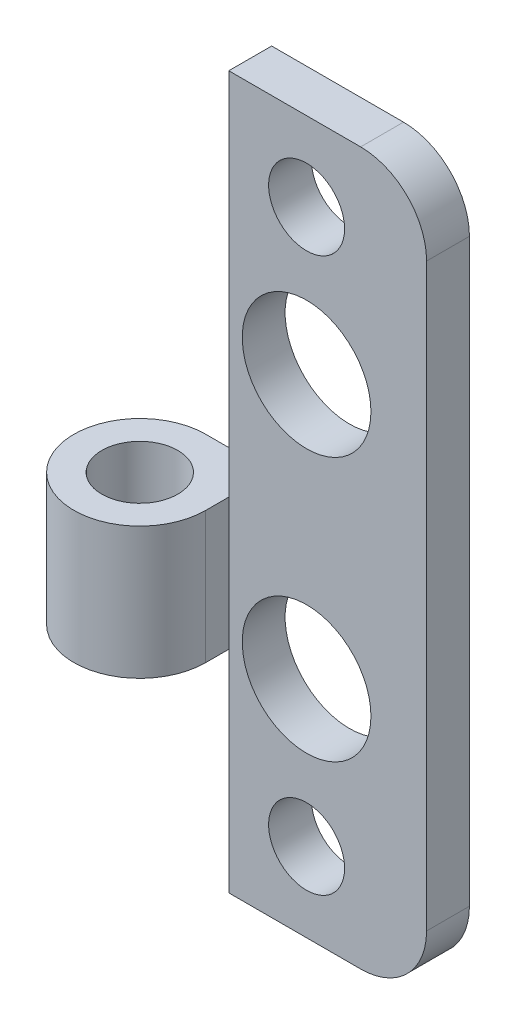
ISO-10303-21;
HEADER;
FILE_DESCRIPTION(('STEP AP214'),'2;1');
FILE_NAME('part.step','',(''),(''),'','','');
FILE_SCHEMA(('AUTOMOTIVE_DESIGN { 1 0 10303 214 1 1 1 1 }'));
ENDSEC;
DATA;
#1=APPLICATION_CONTEXT('core data for automotive mechanical design processes');
#2=APPLICATION_PROTOCOL_DEFINITION('international standard','automotive_design',2000,#1);
#3=PRODUCT_CONTEXT('',#1,'mechanical');
#4=PRODUCT('Part','Part','',(#3));
#5=PRODUCT_RELATED_PRODUCT_CATEGORY('part','',(#4));
#6=PRODUCT_DEFINITION_FORMATION('','',#4);
#7=PRODUCT_DEFINITION_CONTEXT('part definition',#1,'design');
#8=PRODUCT_DEFINITION('design','',#6,#7);
#9=PRODUCT_DEFINITION_SHAPE('','',#8);
#10=(LENGTH_UNIT() NAMED_UNIT(*) SI_UNIT(.MILLI.,.METRE.));
#11=(NAMED_UNIT(*) PLANE_ANGLE_UNIT() SI_UNIT($,.RADIAN.));
#12=(NAMED_UNIT(*) SI_UNIT($,.STERADIAN.) SOLID_ANGLE_UNIT());
#13=UNCERTAINTY_MEASURE_WITH_UNIT(LENGTH_MEASURE(1.E-05),#10,'distance_accuracy_value','');
#14=(GEOMETRIC_REPRESENTATION_CONTEXT(3) GLOBAL_UNCERTAINTY_ASSIGNED_CONTEXT((#13)) GLOBAL_UNIT_ASSIGNED_CONTEXT((#10,
#11,#12)) REPRESENTATION_CONTEXT('',''));
#15=CARTESIAN_POINT('',(0.,0.,0.));
#16=DIRECTION('',(0.,0.,1.));
#17=DIRECTION('',(1.,0.,0.));
#18=AXIS2_PLACEMENT_3D('',#15,#16,#17);
#19=CARTESIAN_POINT('',(0.,0.,4.1275));
#20=DIRECTION('',(1.,0.,0.));
#21=DIRECTION('',(0.,1.,0.));
#22=AXIS2_PLACEMENT_3D('',#19,#20,#21);
#23=PLANE('',#22);
#24=DIRECTION('',(0.,0.,1.));
#25=VECTOR('',#24,1.);
#26=CARTESIAN_POINT('',(0.,20.32,4.1275));
#27=LINE('',#26,#25);
#28=CARTESIAN_POINT('',(0.,20.32,0.));
#29=VERTEX_POINT('',#28);
#30=CARTESIAN_POINT('',(0.,20.32,4.1275));
#31=VERTEX_POINT('',#30);
#32=EDGE_CURVE('E11',#29,#31,#27,.T.);
#33=ORIENTED_EDGE('',*,*,#32,.F.);
#34=DIRECTION('',(0.,-1.,0.));
#35=VECTOR('',#34,1.);
#36=CARTESIAN_POINT('',(0.,0.,0.));
#37=LINE('',#36,#35);
#38=CARTESIAN_POINT('',(0.,0.,0.));
#39=VERTEX_POINT('',#38);
#40=EDGE_CURVE('E134',#29,#39,#37,.T.);
#41=ORIENTED_EDGE('',*,*,#40,.T.);
#42=DIRECTION('',(0.,0.,-1.));
#43=VECTOR('',#42,1.);
#44=CARTESIAN_POINT('',(0.,0.,4.1275));
#45=LINE('',#44,#43);
#46=CARTESIAN_POINT('',(0.,0.,4.1275));
#47=VERTEX_POINT('',#46);
#48=EDGE_CURVE('E148',#47,#39,#45,.T.);
#49=ORIENTED_EDGE('',*,*,#48,.F.);
#50=DIRECTION('',(0.,-1.,0.));
#51=VECTOR('',#50,1.);
#52=CARTESIAN_POINT('',(0.,0.,4.1275));
#53=LINE('',#52,#51);
#54=EDGE_CURVE('E91',#31,#47,#53,.T.);
#55=ORIENTED_EDGE('',*,*,#54,.F.);
#56=EDGE_LOOP('',(#33,#41,#49,#55));
#57=FACE_BOUND('',#56,.T.);
#58=ADVANCED_FACE('F32',(#57),#23,.F.);
#59=CARTESIAN_POINT('',(12.7,62.23,4.1275));
#60=DIRECTION('',(0.,0.,1.));
#61=DIRECTION('',(1.,0.,0.));
#62=AXIS2_PLACEMENT_3D('',#59,#60,#61);
#63=PLANE('',#62);
#64=CARTESIAN_POINT('',(7.49300000000002,21.59,4.1275));
#65=DIRECTION('',(0.,0.,1.));
#66=DIRECTION('',(1.,0.,0.));
#67=AXIS2_PLACEMENT_3D('',#64,#65,#66);
#68=CIRCLE('',#67,6.1976);
#69=CARTESIAN_POINT('',(13.6906,21.59,4.1275));
#70=VERTEX_POINT('',#69);
#71=EDGE_CURVE('E208',#70,#70,#68,.T.);
#72=ORIENTED_EDGE('',*,*,#71,.F.);
#73=EDGE_LOOP('',(#72));
#74=FACE_BOUND('',#73,.T.);
#75=CARTESIAN_POINT('',(7.49300000000006,46.99,4.1275));
#76=DIRECTION('',(0.,0.,1.));
#77=DIRECTION('',(1.,0.,0.));
#78=AXIS2_PLACEMENT_3D('',#75,#76,#77);
#79=CIRCLE('',#78,6.1976);
#80=CARTESIAN_POINT('',(13.6906000000001,46.99,4.1275));
#81=VERTEX_POINT('',#80);
#82=EDGE_CURVE('E202',#81,#81,#79,.T.);
#83=ORIENTED_EDGE('',*,*,#82,.F.);
#84=EDGE_LOOP('',(#83));
#85=FACE_BOUND('',#84,.T.);
#86=CARTESIAN_POINT('',(7.493,60.96,4.1275));
#87=DIRECTION('',(0.,0.,1.));
#88=DIRECTION('',(1.,0.,0.));
#89=AXIS2_PLACEMENT_3D('',#86,#87,#88);
#90=CIRCLE('',#89,3.6576);
#91=CARTESIAN_POINT('',(11.1506,60.96,4.1275));
#92=VERTEX_POINT('',#91);
#93=EDGE_CURVE('E166',#92,#92,#90,.T.);
#94=ORIENTED_EDGE('',*,*,#93,.F.);
#95=EDGE_LOOP('',(#94));
#96=FACE_BOUND('',#95,.T.);
#97=CARTESIAN_POINT('',(0.,68.58,4.1275));
#98=VERTEX_POINT('',#97);
#99=CARTESIAN_POINT('',(0.,33.02,4.1275));
#100=VERTEX_POINT('',#99);
#101=EDGE_CURVE('E153',#98,#100,#53,.T.);
#102=ORIENTED_EDGE('',*,*,#101,.T.);
#103=EDGE_CURVE('E158',#100,#31,#53,.T.);
#104=ORIENTED_EDGE('',*,*,#103,.T.);
#105=ORIENTED_EDGE('',*,*,#54,.T.);
#106=DIRECTION('',(1.,0.,0.));
#107=VECTOR('',#106,1.);
#108=CARTESIAN_POINT('',(0.,0.,4.1275));
#109=LINE('',#108,#107);
#110=CARTESIAN_POINT('',(12.7,0.,4.1275));
#111=VERTEX_POINT('',#110);
#112=EDGE_CURVE('E159',#47,#111,#109,.T.);
#113=ORIENTED_EDGE('',*,*,#112,.T.);
#114=CARTESIAN_POINT('',(12.7,6.35,4.1275));
#115=DIRECTION('',(0.,0.,1.));
#116=DIRECTION('',(1.,0.,0.));
#117=AXIS2_PLACEMENT_3D('',#114,#115,#116);
#118=CIRCLE('',#117,6.35);
#119=CARTESIAN_POINT('',(19.05,6.35000000000005,4.1275));
#120=VERTEX_POINT('',#119);
#121=EDGE_CURVE('E109',#111,#120,#118,.T.);
#122=ORIENTED_EDGE('',*,*,#121,.T.);
#123=DIRECTION('',(0.,1.,0.));
#124=VECTOR('',#123,1.);
#125=CARTESIAN_POINT('',(19.05,6.35000000000004,4.1275));
#126=LINE('',#125,#124);
#127=CARTESIAN_POINT('',(19.05,62.23,4.1275));
#128=VERTEX_POINT('',#127);
#129=EDGE_CURVE('E101',#120,#128,#126,.T.);
#130=ORIENTED_EDGE('',*,*,#129,.T.);
#131=CARTESIAN_POINT('',(12.7,62.23,4.1275));
#132=DIRECTION('',(0.,0.,1.));
#133=DIRECTION('',(1.,0.,0.));
#134=AXIS2_PLACEMENT_3D('',#131,#132,#133);
#135=CIRCLE('',#134,6.35);
#136=CARTESIAN_POINT('',(12.7,68.58,4.1275));
#137=VERTEX_POINT('',#136);
#138=EDGE_CURVE('E106',#128,#137,#135,.T.);
#139=ORIENTED_EDGE('',*,*,#138,.T.);
#140=DIRECTION('',(-1.,0.,0.));
#141=VECTOR('',#140,1.);
#142=CARTESIAN_POINT('',(0.,68.58,4.1275));
#143=LINE('',#142,#141);
#144=EDGE_CURVE('E56',#137,#98,#143,.T.);
#145=ORIENTED_EDGE('',*,*,#144,.T.);
#146=EDGE_LOOP('',(#102,#104,#105,#113,#122,#130,#139,#145));
#147=FACE_BOUND('',#146,.T.);
#148=CARTESIAN_POINT('',(7.49300000000001,7.62,4.1275));
#149=DIRECTION('',(0.,0.,1.));
#150=DIRECTION('',(1.,0.,0.));
#151=AXIS2_PLACEMENT_3D('',#148,#149,#150);
#152=CIRCLE('',#151,3.6576);
#153=CARTESIAN_POINT('',(11.1506,7.62,4.1275));
#154=VERTEX_POINT('',#153);
#155=EDGE_CURVE('E167',#154,#154,#152,.T.);
#156=ORIENTED_EDGE('',*,*,#155,.F.);
#157=EDGE_LOOP('',(#156));
#158=FACE_BOUND('',#157,.T.);
#159=ADVANCED_FACE('F103',(#74,#85,#96,#147,#158),#63,.T.);
#160=CARTESIAN_POINT('',(12.7,62.23,0.));
#161=DIRECTION('',(0.,0.,1.));
#162=DIRECTION('',(1.,0.,0.));
#163=AXIS2_PLACEMENT_3D('',#160,#161,#162);
#164=PLANE('',#163);
#165=CARTESIAN_POINT('',(7.49300000000002,21.59,0.));
#166=DIRECTION('',(0.,0.,1.));
#167=DIRECTION('',(1.,0.,0.));
#168=AXIS2_PLACEMENT_3D('',#165,#166,#167);
#169=CIRCLE('',#168,6.1976);
#170=CARTESIAN_POINT('',(13.6906,21.59,0.));
#171=VERTEX_POINT('',#170);
#172=EDGE_CURVE('E205',#171,#171,#169,.T.);
#173=ORIENTED_EDGE('',*,*,#172,.T.);
#174=EDGE_LOOP('',(#173));
#175=FACE_BOUND('',#174,.T.);
#176=CARTESIAN_POINT('',(7.49300000000006,46.99,0.));
#177=DIRECTION('',(0.,0.,1.));
#178=DIRECTION('',(1.,0.,0.));
#179=AXIS2_PLACEMENT_3D('',#176,#177,#178);
#180=CIRCLE('',#179,6.1976);
#181=CARTESIAN_POINT('',(13.6906000000001,46.99,0.));
#182=VERTEX_POINT('',#181);
#183=EDGE_CURVE('E199',#182,#182,#180,.T.);
#184=ORIENTED_EDGE('',*,*,#183,.T.);
#185=EDGE_LOOP('',(#184));
#186=FACE_BOUND('',#185,.T.);
#187=CARTESIAN_POINT('',(0.,68.58,0.));
#188=VERTEX_POINT('',#187);
#189=CARTESIAN_POINT('',(0.,33.02,0.));
#190=VERTEX_POINT('',#189);
#191=EDGE_CURVE('E130',#188,#190,#37,.T.);
#192=ORIENTED_EDGE('',*,*,#191,.F.);
#193=DIRECTION('',(-1.,0.,0.));
#194=VECTOR('',#193,1.);
#195=CARTESIAN_POINT('',(0.,68.58,0.));
#196=LINE('',#195,#194);
#197=CARTESIAN_POINT('',(12.7,68.58,0.));
#198=VERTEX_POINT('',#197);
#199=EDGE_CURVE('E83',#198,#188,#196,.T.);
#200=ORIENTED_EDGE('',*,*,#199,.F.);
#201=CARTESIAN_POINT('',(12.7,62.23,0.));
#202=DIRECTION('',(0.,0.,1.));
#203=DIRECTION('',(1.,0.,0.));
#204=AXIS2_PLACEMENT_3D('',#201,#202,#203);
#205=CIRCLE('',#204,6.35);
#206=CARTESIAN_POINT('',(19.05,62.23,0.));
#207=VERTEX_POINT('',#206);
#208=EDGE_CURVE('E139',#207,#198,#205,.T.);
#209=ORIENTED_EDGE('',*,*,#208,.F.);
#210=DIRECTION('',(0.,1.,0.));
#211=VECTOR('',#210,1.);
#212=CARTESIAN_POINT('',(19.05,6.35000000000004,0.));
#213=LINE('',#212,#211);
#214=CARTESIAN_POINT('',(19.05,6.35000000000005,0.));
#215=VERTEX_POINT('',#214);
#216=EDGE_CURVE('E118',#215,#207,#213,.T.);
#217=ORIENTED_EDGE('',*,*,#216,.F.);
#218=CARTESIAN_POINT('',(12.7,6.35,0.));
#219=DIRECTION('',(0.,0.,1.));
#220=DIRECTION('',(1.,0.,0.));
#221=AXIS2_PLACEMENT_3D('',#218,#219,#220);
#222=CIRCLE('',#221,6.35);
#223=CARTESIAN_POINT('',(12.7,0.,0.));
#224=VERTEX_POINT('',#223);
#225=EDGE_CURVE('E136',#224,#215,#222,.T.);
#226=ORIENTED_EDGE('',*,*,#225,.F.);
#227=DIRECTION('',(1.,0.,0.));
#228=VECTOR('',#227,1.);
#229=CARTESIAN_POINT('',(0.,0.,0.));
#230=LINE('',#229,#228);
#231=EDGE_CURVE('E133',#39,#224,#230,.T.);
#232=ORIENTED_EDGE('',*,*,#231,.F.);
#233=ORIENTED_EDGE('',*,*,#40,.F.);
#234=DIRECTION('',(-1.,0.,0.));
#235=VECTOR('',#234,1.);
#236=CARTESIAN_POINT('',(0.,20.32,0.));
#237=LINE('',#236,#235);
#238=CARTESIAN_POINT('',(-6.35,20.32,0.));
#239=VERTEX_POINT('',#238);
#240=EDGE_CURVE('E191',#29,#239,#237,.T.);
#241=ORIENTED_EDGE('',*,*,#240,.T.);
#242=DIRECTION('',(0.,1.,0.));
#243=VECTOR('',#242,1.);
#244=CARTESIAN_POINT('',(-6.35,20.32,0.));
#245=LINE('',#244,#243);
#246=CARTESIAN_POINT('',(-6.35,33.02,0.));
#247=VERTEX_POINT('',#246);
#248=EDGE_CURVE('E176',#239,#247,#245,.T.);
#249=ORIENTED_EDGE('',*,*,#248,.T.);
#250=DIRECTION('',(-1.,0.,0.));
#251=VECTOR('',#250,1.);
#252=CARTESIAN_POINT('',(0.,33.02,0.));
#253=LINE('',#252,#251);
#254=EDGE_CURVE('E186',#190,#247,#253,.T.);
#255=ORIENTED_EDGE('',*,*,#254,.F.);
#256=EDGE_LOOP('',(#192,#200,#209,#217,#226,#232,#233,#241,#249,#255));
#257=FACE_BOUND('',#256,.T.);
#258=CARTESIAN_POINT('',(7.493,60.96,0.));
#259=DIRECTION('',(0.,0.,1.));
#260=DIRECTION('',(1.,0.,0.));
#261=AXIS2_PLACEMENT_3D('',#258,#259,#260);
#262=CIRCLE('',#261,3.6576);
#263=CARTESIAN_POINT('',(11.1506,60.96,0.));
#264=VERTEX_POINT('',#263);
#265=EDGE_CURVE('E163',#264,#264,#262,.T.);
#266=ORIENTED_EDGE('',*,*,#265,.T.);
#267=EDGE_LOOP('',(#266));
#268=FACE_BOUND('',#267,.T.);
#269=CARTESIAN_POINT('',(7.49300000000001,7.62,0.));
#270=DIRECTION('',(0.,0.,1.));
#271=DIRECTION('',(1.,0.,0.));
#272=AXIS2_PLACEMENT_3D('',#269,#270,#271);
#273=CIRCLE('',#272,3.6576);
#274=CARTESIAN_POINT('',(11.1506,7.62,0.));
#275=VERTEX_POINT('',#274);
#276=EDGE_CURVE('E170',#275,#275,#273,.T.);
#277=ORIENTED_EDGE('',*,*,#276,.T.);
#278=EDGE_LOOP('',(#277));
#279=FACE_BOUND('',#278,.T.);
#280=ADVANCED_FACE('F214',(#175,#186,#257,#268,#279),#164,.F.);
#281=ORIENTED_EDGE('',*,*,#191,.T.);
#282=DIRECTION('',(0.,0.,1.));
#283=VECTOR('',#282,1.);
#284=CARTESIAN_POINT('',(0.,33.02,4.1275));
#285=LINE('',#284,#283);
#286=EDGE_CURVE('E40',#190,#100,#285,.T.);
#287=ORIENTED_EDGE('',*,*,#286,.T.);
#288=ORIENTED_EDGE('',*,*,#101,.F.);
#289=DIRECTION('',(0.,0.,-1.));
#290=VECTOR('',#289,1.);
#291=CARTESIAN_POINT('',(0.,68.58,4.1275));
#292=LINE('',#291,#290);
#293=EDGE_CURVE('E126',#98,#188,#292,.T.);
#294=ORIENTED_EDGE('',*,*,#293,.T.);
#295=EDGE_LOOP('',(#281,#287,#288,#294));
#296=FACE_BOUND('',#295,.T.);
#297=ADVANCED_FACE('F34',(#296),#23,.F.);
#298=CARTESIAN_POINT('',(0.,0.,4.1275));
#299=DIRECTION('',(0.,1.,0.));
#300=DIRECTION('',(0.,0.,1.));
#301=AXIS2_PLACEMENT_3D('',#298,#299,#300);
#302=PLANE('',#301);
#303=ORIENTED_EDGE('',*,*,#231,.T.);
#304=DIRECTION('',(0.,0.,-1.));
#305=VECTOR('',#304,1.);
#306=CARTESIAN_POINT('',(12.7,0.,4.1275));
#307=LINE('',#306,#305);
#308=EDGE_CURVE('E145',#111,#224,#307,.T.);
#309=ORIENTED_EDGE('',*,*,#308,.F.);
#310=ORIENTED_EDGE('',*,*,#112,.F.);
#311=ORIENTED_EDGE('',*,*,#48,.T.);
#312=EDGE_LOOP('',(#303,#309,#310,#311));
#313=FACE_BOUND('',#312,.T.);
#314=ADVANCED_FACE('F261',(#313),#302,.F.);
#315=CARTESIAN_POINT('',(12.7,6.35,4.1275));
#316=DIRECTION('',(0.,0.,-1.));
#317=DIRECTION('',(-1.,0.,0.));
#318=AXIS2_PLACEMENT_3D('',#315,#316,#317);
#319=CYLINDRICAL_SURFACE('',#318,6.35);
#320=ORIENTED_EDGE('',*,*,#225,.T.);
#321=DIRECTION('',(0.,0.,-1.));
#322=VECTOR('',#321,1.);
#323=CARTESIAN_POINT('',(19.05,6.35000000000005,4.1275));
#324=LINE('',#323,#322);
#325=EDGE_CURVE('E121',#120,#215,#324,.T.);
#326=ORIENTED_EDGE('',*,*,#325,.F.);
#327=ORIENTED_EDGE('',*,*,#121,.F.);
#328=ORIENTED_EDGE('',*,*,#308,.T.);
#329=EDGE_LOOP('',(#320,#326,#327,#328));
#330=FACE_BOUND('',#329,.T.);
#331=ADVANCED_FACE('F265',(#330),#319,.T.);
#332=CARTESIAN_POINT('',(19.05,6.35000000000004,4.1275));
#333=DIRECTION('',(-1.,0.,0.));
#334=DIRECTION('',(0.,-1.,0.));
#335=AXIS2_PLACEMENT_3D('',#332,#333,#334);
#336=PLANE('',#335);
#337=ORIENTED_EDGE('',*,*,#216,.T.);
#338=DIRECTION('',(0.,0.,-1.));
#339=VECTOR('',#338,1.);
#340=CARTESIAN_POINT('',(19.05,62.23,4.1275));
#341=LINE('',#340,#339);
#342=EDGE_CURVE('E115',#128,#207,#341,.T.);
#343=ORIENTED_EDGE('',*,*,#342,.F.);
#344=ORIENTED_EDGE('',*,*,#129,.F.);
#345=ORIENTED_EDGE('',*,*,#325,.T.);
#346=EDGE_LOOP('',(#337,#343,#344,#345));
#347=FACE_BOUND('',#346,.T.);
#348=ADVANCED_FACE('F116',(#347),#336,.F.);
#349=CARTESIAN_POINT('',(12.7,62.23,4.1275));
#350=DIRECTION('',(0.,0.,-1.));
#351=DIRECTION('',(-1.,0.,0.));
#352=AXIS2_PLACEMENT_3D('',#349,#350,#351);
#353=CYLINDRICAL_SURFACE('',#352,6.35);
#354=ORIENTED_EDGE('',*,*,#208,.T.);
#355=DIRECTION('',(0.,0.,-1.));
#356=VECTOR('',#355,1.);
#357=CARTESIAN_POINT('',(12.7,68.58,4.1275));
#358=LINE('',#357,#356);
#359=EDGE_CURVE('E122',#137,#198,#358,.T.);
#360=ORIENTED_EDGE('',*,*,#359,.F.);
#361=ORIENTED_EDGE('',*,*,#138,.F.);
#362=ORIENTED_EDGE('',*,*,#342,.T.);
#363=EDGE_LOOP('',(#354,#360,#361,#362));
#364=FACE_BOUND('',#363,.T.);
#365=ADVANCED_FACE('F124',(#364),#353,.T.);
#366=CARTESIAN_POINT('',(0.,68.58,4.1275));
#367=DIRECTION('',(0.,-1.,0.));
#368=DIRECTION('',(0.,0.,-1.));
#369=AXIS2_PLACEMENT_3D('',#366,#367,#368);
#370=PLANE('',#369);
#371=ORIENTED_EDGE('',*,*,#199,.T.);
#372=ORIENTED_EDGE('',*,*,#293,.F.);
#373=ORIENTED_EDGE('',*,*,#144,.F.);
#374=ORIENTED_EDGE('',*,*,#359,.T.);
#375=EDGE_LOOP('',(#371,#372,#373,#374));
#376=FACE_BOUND('',#375,.T.);
#377=ADVANCED_FACE('F235',(#376),#370,.F.);
#378=CARTESIAN_POINT('',(7.493,60.96,4.1275));
#379=DIRECTION('',(0.,0.,-1.));
#380=DIRECTION('',(-1.,0.,0.));
#381=AXIS2_PLACEMENT_3D('',#378,#379,#380);
#382=CYLINDRICAL_SURFACE('',#381,3.6576);
#383=ORIENTED_EDGE('',*,*,#93,.T.);
#384=EDGE_LOOP('',(#383));
#385=FACE_BOUND('',#384,.T.);
#386=ORIENTED_EDGE('',*,*,#265,.F.);
#387=EDGE_LOOP('',(#386));
#388=FACE_BOUND('',#387,.T.);
#389=ADVANCED_FACE('F231',(#385,#388),#382,.F.);
#390=CARTESIAN_POINT('',(7.49300000000001,7.62,4.1275));
#391=DIRECTION('',(0.,0.,-1.));
#392=DIRECTION('',(-1.,0.,0.));
#393=AXIS2_PLACEMENT_3D('',#390,#391,#392);
#394=CYLINDRICAL_SURFACE('',#393,3.6576);
#395=ORIENTED_EDGE('',*,*,#155,.T.);
#396=EDGE_LOOP('',(#395));
#397=FACE_BOUND('',#396,.T.);
#398=ORIENTED_EDGE('',*,*,#276,.F.);
#399=EDGE_LOOP('',(#398));
#400=FACE_BOUND('',#399,.T.);
#401=ADVANCED_FACE('F234',(#397,#400),#394,.F.);
#402=CARTESIAN_POINT('',(0.,20.32,6.35));
#403=DIRECTION('',(1.,0.,0.));
#404=DIRECTION('',(0.,0.,-1.));
#405=AXIS2_PLACEMENT_3D('',#402,#403,#404);
#406=PLANE('',#405);
#407=DIRECTION('',(0.,0.,-1.));
#408=VECTOR('',#407,1.);
#409=CARTESIAN_POINT('',(0.,20.32,4.1275));
#410=LINE('',#409,#408);
#411=CARTESIAN_POINT('',(0.,20.32,6.35));
#412=VERTEX_POINT('',#411);
#413=EDGE_CURVE('E183',#412,#31,#410,.T.);
#414=ORIENTED_EDGE('',*,*,#413,.T.);
#415=ORIENTED_EDGE('',*,*,#103,.F.);
#416=DIRECTION('',(0.,0.,-1.));
#417=VECTOR('',#416,1.);
#418=CARTESIAN_POINT('',(0.,33.02,6.35));
#419=LINE('',#418,#417);
#420=CARTESIAN_POINT('',(0.,33.02,6.35));
#421=VERTEX_POINT('',#420);
#422=EDGE_CURVE('E47',#421,#100,#419,.T.);
#423=ORIENTED_EDGE('',*,*,#422,.F.);
#424=DIRECTION('',(0.,1.,0.));
#425=VECTOR('',#424,1.);
#426=CARTESIAN_POINT('',(0.,20.32,6.35));
#427=LINE('',#426,#425);
#428=EDGE_CURVE('E173',#412,#421,#427,.T.);
#429=ORIENTED_EDGE('',*,*,#428,.F.);
#430=EDGE_LOOP('',(#414,#415,#423,#429));
#431=FACE_BOUND('',#430,.T.);
#432=ADVANCED_FACE('F245',(#431),#406,.T.);
#433=CARTESIAN_POINT('',(-6.35,20.32,6.35));
#434=DIRECTION('',(0.,1.,0.));
#435=DIRECTION('',(0.,0.,1.));
#436=AXIS2_PLACEMENT_3D('',#433,#434,#435);
#437=CYLINDRICAL_SURFACE('',#436,6.35);
#438=CARTESIAN_POINT('',(-6.35,33.02,6.35));
#439=DIRECTION('',(0.,1.,0.));
#440=DIRECTION('',(0.,0.,1.));
#441=AXIS2_PLACEMENT_3D('',#438,#439,#440);
#442=CIRCLE('',#441,6.35);
#443=EDGE_CURVE('E184',#247,#421,#442,.T.);
#444=ORIENTED_EDGE('',*,*,#443,.F.);
#445=ORIENTED_EDGE('',*,*,#248,.F.);
#446=CARTESIAN_POINT('',(-6.35,20.32,6.35));
#447=DIRECTION('',(0.,1.,0.));
#448=DIRECTION('',(0.,0.,1.));
#449=AXIS2_PLACEMENT_3D('',#446,#447,#448);
#450=CIRCLE('',#449,6.35);
#451=EDGE_CURVE('E179',#239,#412,#450,.T.);
#452=ORIENTED_EDGE('',*,*,#451,.T.);
#453=ORIENTED_EDGE('',*,*,#428,.T.);
#454=EDGE_LOOP('',(#444,#445,#452,#453));
#455=FACE_BOUND('',#454,.T.);
#456=ADVANCED_FACE('F251',(#455),#437,.T.);
#457=CARTESIAN_POINT('',(-6.35,20.32,6.35));
#458=DIRECTION('',(0.,1.,0.));
#459=DIRECTION('',(0.,0.,1.));
#460=AXIS2_PLACEMENT_3D('',#457,#458,#459);
#461=PLANE('',#460);
#462=CARTESIAN_POINT('',(-6.35,20.32,6.35));
#463=DIRECTION('',(0.,1.,0.));
#464=DIRECTION('',(0.,0.,1.));
#465=AXIS2_PLACEMENT_3D('',#462,#463,#464);
#466=CIRCLE('',#465,3.6576);
#467=CARTESIAN_POINT('',(-6.35,20.32,10.0076));
#468=VERTEX_POINT('',#467);
#469=EDGE_CURVE('E188',#468,#468,#466,.T.);
#470=ORIENTED_EDGE('',*,*,#469,.T.);
#471=EDGE_LOOP('',(#470));
#472=FACE_BOUND('',#471,.T.);
#473=ORIENTED_EDGE('',*,*,#413,.F.);
#474=ORIENTED_EDGE('',*,*,#451,.F.);
#475=ORIENTED_EDGE('',*,*,#240,.F.);
#476=ORIENTED_EDGE('',*,*,#32,.T.);
#477=EDGE_LOOP('',(#473,#474,#475,#476));
#478=FACE_BOUND('',#477,.T.);
#479=ADVANCED_FACE('F317',(#472,#478),#461,.F.);
#480=CARTESIAN_POINT('',(-6.35,33.02,6.35));
#481=DIRECTION('',(0.,1.,0.));
#482=DIRECTION('',(0.,0.,1.));
#483=AXIS2_PLACEMENT_3D('',#480,#481,#482);
#484=PLANE('',#483);
#485=CARTESIAN_POINT('',(-6.35,33.02,6.35));
#486=DIRECTION('',(0.,1.,0.));
#487=DIRECTION('',(0.,0.,1.));
#488=AXIS2_PLACEMENT_3D('',#485,#486,#487);
#489=CIRCLE('',#488,3.6576);
#490=CARTESIAN_POINT('',(-6.35,33.02,10.0076));
#491=VERTEX_POINT('',#490);
#492=EDGE_CURVE('E196',#491,#491,#489,.T.);
#493=ORIENTED_EDGE('',*,*,#492,.F.);
#494=EDGE_LOOP('',(#493));
#495=FACE_BOUND('',#494,.T.);
#496=ORIENTED_EDGE('',*,*,#422,.T.);
#497=ORIENTED_EDGE('',*,*,#286,.F.);
#498=ORIENTED_EDGE('',*,*,#254,.T.);
#499=ORIENTED_EDGE('',*,*,#443,.T.);
#500=EDGE_LOOP('',(#496,#497,#498,#499));
#501=FACE_BOUND('',#500,.T.);
#502=ADVANCED_FACE('F326',(#495,#501),#484,.T.);
#503=CARTESIAN_POINT('',(-6.35,20.32,6.35));
#504=DIRECTION('',(0.,1.,0.));
#505=DIRECTION('',(0.,0.,1.));
#506=AXIS2_PLACEMENT_3D('',#503,#504,#505);
#507=CYLINDRICAL_SURFACE('',#506,3.6576);
#508=ORIENTED_EDGE('',*,*,#469,.F.);
#509=EDGE_LOOP('',(#508));
#510=FACE_BOUND('',#509,.T.);
#511=ORIENTED_EDGE('',*,*,#492,.T.);
#512=EDGE_LOOP('',(#511));
#513=FACE_BOUND('',#512,.T.);
#514=ADVANCED_FACE('F336',(#510,#513),#507,.F.);
#515=CARTESIAN_POINT('',(7.49300000000006,46.99,0.));
#516=DIRECTION('',(0.,0.,1.));
#517=DIRECTION('',(1.,0.,0.));
#518=AXIS2_PLACEMENT_3D('',#515,#516,#517);
#519=CYLINDRICAL_SURFACE('',#518,6.1976);
#520=ORIENTED_EDGE('',*,*,#183,.F.);
#521=EDGE_LOOP('',(#520));
#522=FACE_BOUND('',#521,.T.);
#523=ORIENTED_EDGE('',*,*,#82,.T.);
#524=EDGE_LOOP('',(#523));
#525=FACE_BOUND('',#524,.T.);
#526=ADVANCED_FACE('F220',(#522,#525),#519,.F.);
#527=CARTESIAN_POINT('',(7.49300000000002,21.59,0.));
#528=DIRECTION('',(0.,0.,1.));
#529=DIRECTION('',(1.,0.,0.));
#530=AXIS2_PLACEMENT_3D('',#527,#528,#529);
#531=CYLINDRICAL_SURFACE('',#530,6.1976);
#532=ORIENTED_EDGE('',*,*,#172,.F.);
#533=EDGE_LOOP('',(#532));
#534=FACE_BOUND('',#533,.T.);
#535=ORIENTED_EDGE('',*,*,#71,.T.);
#536=EDGE_LOOP('',(#535));
#537=FACE_BOUND('',#536,.T.);
#538=ADVANCED_FACE('F217',(#534,#537),#531,.F.);
#539=CLOSED_SHELL('',(#58,#159,#280,#297,#314,#331,#348,#365,#377,#389,#401,#432,#456,#479,#502,
#514,#526,#538));
#540=MANIFOLD_SOLID_BREP('B2',#539);
#541=ADVANCED_BREP_SHAPE_REPRESENTATION('',(#18,#540),#14);
#542=SHAPE_DEFINITION_REPRESENTATION(#9,#541);
ENDSEC;
END-ISO-10303-21;
